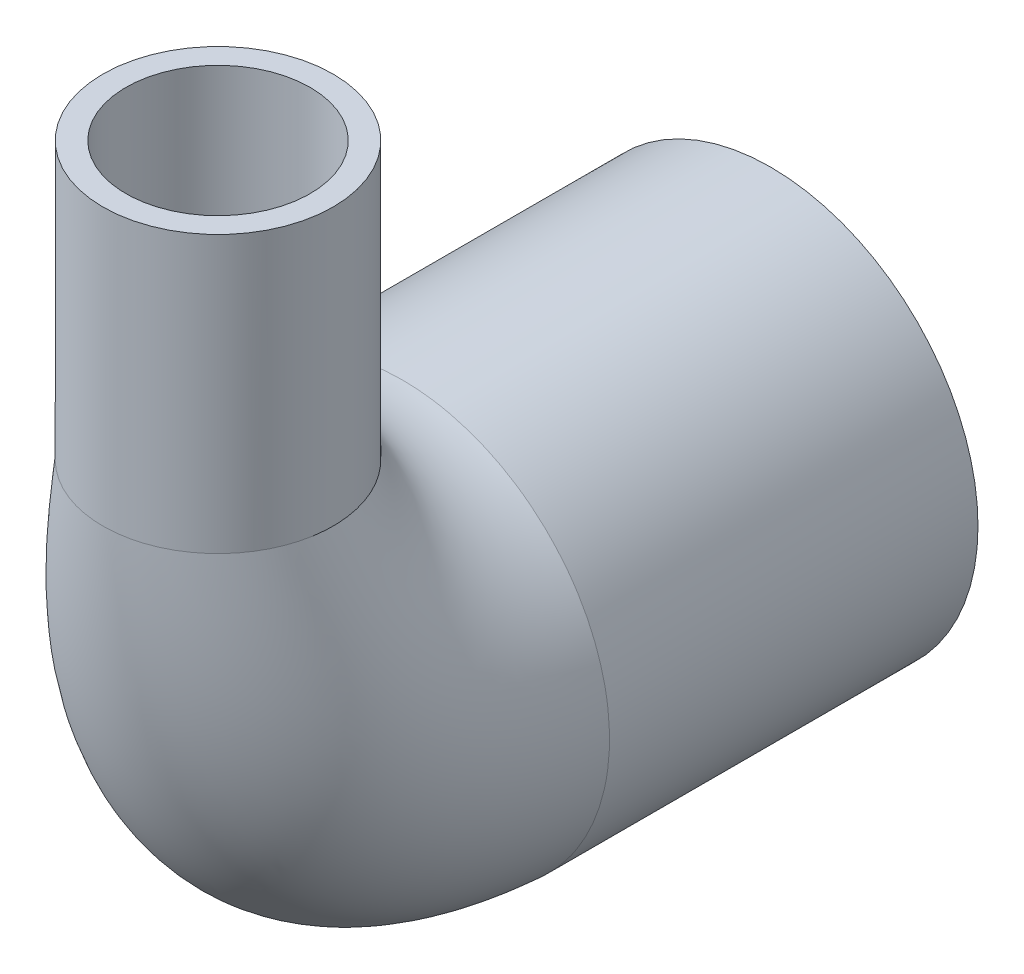
ISO-10303-21;
HEADER;
FILE_DESCRIPTION(('STEP AP214'),'2;1');
FILE_NAME('part.step','',(''),(''),'','','');
FILE_SCHEMA(('AUTOMOTIVE_DESIGN { 1 0 10303 214 1 1 1 1 }'));
ENDSEC;
DATA;
#1=APPLICATION_CONTEXT('core data for automotive mechanical design processes');
#2=APPLICATION_PROTOCOL_DEFINITION('international standard','automotive_design',2000,#1);
#3=PRODUCT_CONTEXT('',#1,'mechanical');
#4=PRODUCT('Part','Part','',(#3));
#5=PRODUCT_RELATED_PRODUCT_CATEGORY('part','',(#4));
#6=PRODUCT_DEFINITION_FORMATION('','',#4);
#7=PRODUCT_DEFINITION_CONTEXT('part definition',#1,'design');
#8=PRODUCT_DEFINITION('design','',#6,#7);
#9=PRODUCT_DEFINITION_SHAPE('','',#8);
#10=(LENGTH_UNIT() NAMED_UNIT(*) SI_UNIT(.MILLI.,.METRE.));
#11=(NAMED_UNIT(*) PLANE_ANGLE_UNIT() SI_UNIT($,.RADIAN.));
#12=(NAMED_UNIT(*) SI_UNIT($,.STERADIAN.) SOLID_ANGLE_UNIT());
#13=UNCERTAINTY_MEASURE_WITH_UNIT(LENGTH_MEASURE(1.E-05),#10,'distance_accuracy_value','');
#14=(GEOMETRIC_REPRESENTATION_CONTEXT(3) GLOBAL_UNCERTAINTY_ASSIGNED_CONTEXT((#13)) GLOBAL_UNIT_ASSIGNED_CONTEXT((#10,
#11,#12)) REPRESENTATION_CONTEXT('',''));
#15=CARTESIAN_POINT('',(0.,0.,0.));
#16=DIRECTION('',(0.,0.,1.));
#17=DIRECTION('',(1.,0.,0.));
#18=AXIS2_PLACEMENT_3D('',#15,#16,#17);
#19=CARTESIAN_POINT('',(0.,34.925,12.7));
#20=DIRECTION('',(0.,-1.,0.));
#21=DIRECTION('',(0.,0.,1.));
#22=AXIS2_PLACEMENT_3D('',#19,#20,#21);
#23=CYLINDRICAL_SURFACE('',#22,7.9375);
#24=CARTESIAN_POINT('',(0.,34.925,12.7));
#25=DIRECTION('',(0.,-1.,0.));
#26=DIRECTION('',(0.,0.,-1.));
#27=AXIS2_PLACEMENT_3D('',#24,#25,#26);
#28=CIRCLE('',#27,7.9375);
#29=CARTESIAN_POINT('',(0.,34.925,4.7625));
#30=VERTEX_POINT('',#29);
#31=EDGE_CURVE('E11',#30,#30,#28,.T.);
#32=ORIENTED_EDGE('',*,*,#31,.T.);
#33=EDGE_LOOP('',(#32));
#34=FACE_BOUND('',#33,.T.);
#35=CARTESIAN_POINT('',(0.,15.875,4.7625));
#36=CARTESIAN_POINT('',(1.03901631203661,15.875,4.7625));
#37=CARTESIAN_POINT('',(3.11660011568606,15.875,5.17531265422968));
#38=CARTESIAN_POINT('',(5.75911265232572,15.875,6.94111772182166));
#39=CARTESIAN_POINT('',(7.52441747909447,15.875,9.58324716542323));
#40=CARTESIAN_POINT('',(8.14446456888548,15.875,12.7));
#41=CARTESIAN_POINT('',(7.52441747909448,15.875,15.8167528345768));
#42=CARTESIAN_POINT('',(5.7591126523257,15.875,18.4588822781783));
#43=CARTESIAN_POINT('',(3.11660011568607,15.875,20.2246873457703));
#44=CARTESIAN_POINT('',(1.03901631203661,15.875,20.6375));
#45=CARTESIAN_POINT('',(-1.03901631203661,15.875,20.6375));
#46=CARTESIAN_POINT('',(-3.11660011568606,15.875,20.2246873457703));
#47=CARTESIAN_POINT('',(-5.75911265232573,15.875,18.4588822781783));
#48=CARTESIAN_POINT('',(-7.52441747909447,15.875,15.8167528345768));
#49=CARTESIAN_POINT('',(-8.14446456888548,15.875,12.7));
#50=CARTESIAN_POINT('',(-7.52441747909448,15.875,9.58324716542323));
#51=CARTESIAN_POINT('',(-5.75911265232571,15.875,6.94111772182166));
#52=CARTESIAN_POINT('',(-3.11660011568607,15.875,5.17531265422968));
#53=CARTESIAN_POINT('',(-1.03901631203661,15.875,4.7625));
#54=CARTESIAN_POINT('',(0.,15.875,4.7625));
#55=B_SPLINE_CURVE_WITH_KNOTS('',3,(#35,#36,#37,#38,#39,#40,#41,#42,#43,#44,#45,#46,#47,#48,#49,
#50,#51,#52,#53,#54),.UNSPECIFIED.,.T.,.F.,(4,1,1,1,1,1,1,1,2,1,1,1,1,1,1,1,4),(0.,0.0625,0.125,
0.1875,0.25,0.3125,0.375,0.4375,0.5,0.5625,0.625,0.6875,0.75,0.8125,0.875,0.9375,1.),.UNSPECIFIED.);
#56=CARTESIAN_POINT('',(0.,15.875,4.7625));
#57=VERTEX_POINT('',#56);
#58=EDGE_CURVE('E60',#57,#57,#55,.T.);
#59=ORIENTED_EDGE('',*,*,#58,.F.);
#60=EDGE_LOOP('',(#59));
#61=FACE_BOUND('',#60,.T.);
#62=ADVANCED_FACE('F45',(#34,#61),#23,.T.);
#63=CARTESIAN_POINT('',(0.,34.925,12.7));
#64=DIRECTION('',(0.,1.,0.));
#65=DIRECTION('',(0.,0.,-1.));
#66=AXIS2_PLACEMENT_3D('',#63,#64,#65);
#67=PLANE('',#66);
#68=CARTESIAN_POINT('',(0.,34.925,12.7));
#69=DIRECTION('',(0.,-1.,0.));
#70=DIRECTION('',(0.,0.,-1.));
#71=AXIS2_PLACEMENT_3D('',#68,#69,#70);
#72=CIRCLE('',#71,6.35);
#73=CARTESIAN_POINT('',(0.,34.925,6.35));
#74=VERTEX_POINT('',#73);
#75=EDGE_CURVE('E55',#74,#74,#72,.T.);
#76=ORIENTED_EDGE('',*,*,#75,.T.);
#77=EDGE_LOOP('',(#76));
#78=FACE_BOUND('',#77,.T.);
#79=ORIENTED_EDGE('',*,*,#31,.F.);
#80=EDGE_LOOP('',(#79));
#81=FACE_BOUND('',#80,.T.);
#82=ADVANCED_FACE('F95',(#78,#81),#67,.T.);
#83=CARTESIAN_POINT('',(0.,15.875,12.7));
#84=DIRECTION('',(0.,1.,0.));
#85=DIRECTION('',(0.,0.,-1.));
#86=AXIS2_PLACEMENT_3D('',#83,#84,#85);
#87=CYLINDRICAL_SURFACE('',#86,6.35);
#88=CARTESIAN_POINT('',(0.,15.875,6.35));
#89=CARTESIAN_POINT('',(-0.831213049629288,15.875,6.35));
#90=CARTESIAN_POINT('',(-2.49329864021113,15.875,6.68022769998427));
#91=CARTESIAN_POINT('',(-4.60717931448023,15.875,8.09289219249636));
#92=CARTESIAN_POINT('',(-6.01961280137387,15.875,10.2065828619552));
#93=CARTESIAN_POINT('',(-6.5155211618228,15.875,12.7));
#94=CARTESIAN_POINT('',(-6.01961280137387,15.875,15.1934171380447));
#95=CARTESIAN_POINT('',(-4.60717931448022,15.875,17.3071078075037));
#96=CARTESIAN_POINT('',(-2.49329864021115,15.875,18.7197723000157));
#97=CARTESIAN_POINT('',(-0.831213049629288,15.875,19.05));
#98=CARTESIAN_POINT('',(0.831213049629286,15.875,19.05));
#99=CARTESIAN_POINT('',(2.49329864021113,15.875,18.7197723000157));
#100=CARTESIAN_POINT('',(4.60717931448023,15.875,17.3071078075036));
#101=CARTESIAN_POINT('',(6.01961280137386,15.875,15.1934171380447));
#102=CARTESIAN_POINT('',(6.5155211618228,15.875,12.7));
#103=CARTESIAN_POINT('',(6.01961280137387,15.875,10.2065828619553));
#104=CARTESIAN_POINT('',(4.60717931448022,15.875,8.09289219249633));
#105=CARTESIAN_POINT('',(2.49329864021114,15.875,6.68022769998429));
#106=CARTESIAN_POINT('',(0.831213049629285,15.875,6.35));
#107=CARTESIAN_POINT('',(0.,15.875,6.35));
#108=B_SPLINE_CURVE_WITH_KNOTS('',3,(#88,#89,#90,#91,#92,#93,#94,#95,#96,#97,#98,#99,#100,#101,
#102,#103,#104,#105,#106,#107),.UNSPECIFIED.,.T.,.F.,(4,1,1,1,1,1,1,1,2,1,1,1,1,1,1,1,4),(0.,
0.0625,0.125,0.1875,0.25,0.3125,0.375,0.4375,0.5,0.5625,0.625,0.6875,0.75,0.8125,0.875,0.9375,
1.),.UNSPECIFIED.);
#109=CARTESIAN_POINT('',(0.,15.875,6.35));
#110=VERTEX_POINT('',#109);
#111=EDGE_CURVE('E80',#110,#110,#108,.F.);
#112=ORIENTED_EDGE('',*,*,#111,.T.);
#113=EDGE_LOOP('',(#112));
#114=FACE_BOUND('',#113,.T.);
#115=ORIENTED_EDGE('',*,*,#75,.F.);
#116=EDGE_LOOP('',(#115));
#117=FACE_BOUND('',#116,.T.);
#118=ADVANCED_FACE('F85',(#114,#117),#87,.F.);
#119=CARTESIAN_POINT('',(0.,14.2875,0.));
#120=CARTESIAN_POINT('',(0.,14.2875,3.175));
#121=CARTESIAN_POINT('',(0.,15.113,4.7625));
#122=CARTESIAN_POINT('',(0.,15.875,4.7625));
#123=CARTESIAN_POINT('',(1.8702293616659,14.2875,0.));
#124=CARTESIAN_POINT('',(1.5931583451228,14.2875,3.175));
#125=CARTESIAN_POINT('',(1.3160873285797,15.113,4.7625));
#126=CARTESIAN_POINT('',(1.03901631203661,15.875,4.7625));
#127=CARTESIAN_POINT('',(5.61001135472224,13.5442463688287,0.));
#128=CARTESIAN_POINT('',(4.77887427504352,13.4943413292191,3.64333338474323));
#129=CARTESIAN_POINT('',(3.94773719536479,14.7898425396096,5.20307301948645));
#130=CARTESIAN_POINT('',(3.11660011568606,15.875,5.17531265422968));
#131=CARTESIAN_POINT('',(10.3662299142062,10.3660680461271,0.));
#132=CARTESIAN_POINT('',(8.83052416024602,10.2593448432514,5.47216944894056));
#133=CARTESIAN_POINT('',(7.29481840628587,13.4476763278757,7.00039358538111));
#134=CARTESIAN_POINT('',(5.75911265232572,15.875,6.94111772182166));
#135=CARTESIAN_POINT('',(13.5439910202834,5.61016906306011,0.));
#136=CARTESIAN_POINT('',(11.5374665065538,5.52605020870675,8.08920738847441));
#137=CARTESIAN_POINT('',(9.53094199282413,11.4664938543534,9.62997727694882));
#138=CARTESIAN_POINT('',(7.52441747909447,15.875,9.58324716542323));
#139=CARTESIAN_POINT('',(14.6600049875499,0.,0.));
#140=CARTESIAN_POINT('',(12.4881581813284,0.,11.1125));
#141=CARTESIAN_POINT('',(10.316311375107,9.14400000000001,12.7));
#142=CARTESIAN_POINT('',(8.14446456888548,15.875,12.7));
#143=CARTESIAN_POINT('',(13.5439910202834,-5.61016906306017,0.));
#144=CARTESIAN_POINT('',(11.5374665065538,-5.52605020870677,14.1357926115256));
#145=CARTESIAN_POINT('',(9.53094199282413,6.82150614564664,15.7700227230512));
#146=CARTESIAN_POINT('',(7.52441747909448,15.875,15.8167528345768));
#147=CARTESIAN_POINT('',(10.3662299142062,-10.366068046127,0.));
#148=CARTESIAN_POINT('',(8.83052416024602,-10.2593448432513,16.7528305510594));
#149=CARTESIAN_POINT('',(7.29481840628586,4.84032367212433,18.3996064146189));
#150=CARTESIAN_POINT('',(5.7591126523257,15.875,18.4588822781783));
#151=CARTESIAN_POINT('',(5.61001135472226,-13.5442463688287,0.));
#152=CARTESIAN_POINT('',(4.77887427504353,-13.4943413292191,18.5816666152568));
#153=CARTESIAN_POINT('',(3.9477371953648,3.49815746039044,20.1969269805136));
#154=CARTESIAN_POINT('',(3.11660011568607,15.875,20.2246873457703));
#155=CARTESIAN_POINT('',(1.87022936166589,-14.2875,0.));
#156=CARTESIAN_POINT('',(1.5931583451228,-14.2875,19.05));
#157=CARTESIAN_POINT('',(1.3160873285797,3.17500000000001,20.6375));
#158=CARTESIAN_POINT('',(1.03901631203661,15.875,20.6375));
#159=CARTESIAN_POINT('',(-1.8702293616659,-14.2875,0.));
#160=CARTESIAN_POINT('',(-1.5931583451228,-14.2875,19.05));
#161=CARTESIAN_POINT('',(-1.3160873285797,3.17500000000001,20.6375));
#162=CARTESIAN_POINT('',(-1.03901631203661,15.875,20.6375));
#163=CARTESIAN_POINT('',(-5.61001135472223,-13.5442463688287,0.));
#164=CARTESIAN_POINT('',(-4.77887427504351,-13.4943413292191,18.5816666152568));
#165=CARTESIAN_POINT('',(-3.94773719536479,3.49815746039046,20.1969269805136));
#166=CARTESIAN_POINT('',(-3.11660011568606,15.875,20.2246873457703));
#167=CARTESIAN_POINT('',(-10.3662299142062,-10.3660680461271,0.));
#168=CARTESIAN_POINT('',(-8.83052416024603,-10.2593448432514,16.7528305510594));
#169=CARTESIAN_POINT('',(-7.29481840628588,4.84032367212432,18.3996064146189));
#170=CARTESIAN_POINT('',(-5.75911265232573,15.875,18.4588822781783));
#171=CARTESIAN_POINT('',(-13.5439910202834,-5.61016906306011,0.));
#172=CARTESIAN_POINT('',(-11.5374665065538,-5.52605020870674,14.1357926115256));
#173=CARTESIAN_POINT('',(-9.53094199282412,6.82150614564665,15.7700227230512));
#174=CARTESIAN_POINT('',(-7.52441747909447,15.875,15.8167528345768));
#175=CARTESIAN_POINT('',(-14.6600049875499,0.,0.));
#176=CARTESIAN_POINT('',(-12.4881581813284,0.,11.1125));
#177=CARTESIAN_POINT('',(-10.3163113751069,9.14399999999999,12.7));
#178=CARTESIAN_POINT('',(-8.14446456888548,15.875,12.7));
#179=CARTESIAN_POINT('',(-13.5439910202834,5.61016906306014,0.));
#180=CARTESIAN_POINT('',(-11.5374665065538,5.52605020870677,8.08920738847441));
#181=CARTESIAN_POINT('',(-9.53094199282414,11.4664938543534,9.62997727694882));
#182=CARTESIAN_POINT('',(-7.52441747909448,15.875,9.58324716542323));
#183=CARTESIAN_POINT('',(-10.3662299142061,10.366068046127,0.));
#184=CARTESIAN_POINT('',(-8.830524160246,10.2593448432514,5.47216944894056));
#185=CARTESIAN_POINT('',(-7.29481840628586,13.4476763278757,7.00039358538111));
#186=CARTESIAN_POINT('',(-5.75911265232571,15.875,6.94111772182166));
#187=CARTESIAN_POINT('',(-5.61001135472226,13.5442463688287,0.));
#188=CARTESIAN_POINT('',(-4.77887427504353,13.4943413292191,3.64333338474323));
#189=CARTESIAN_POINT('',(-3.9477371953648,14.7898425396096,5.20307301948645));
#190=CARTESIAN_POINT('',(-3.11660011568607,15.875,5.17531265422968));
#191=CARTESIAN_POINT('',(-1.87022936166589,14.2875,0.));
#192=CARTESIAN_POINT('',(-1.5931583451228,14.2875,3.175));
#193=CARTESIAN_POINT('',(-1.3160873285797,15.113,4.7625));
#194=CARTESIAN_POINT('',(-1.03901631203661,15.875,4.7625));
#195=CARTESIAN_POINT('',(0.,14.2875,0.));
#196=CARTESIAN_POINT('',(0.,14.2875,3.175));
#197=CARTESIAN_POINT('',(0.,15.113,4.7625));
#198=CARTESIAN_POINT('',(0.,15.875,4.7625));
#199=B_SPLINE_SURFACE_WITH_KNOTS('',3,3,((#119,#120,#121,#122),(#123,#124,#125,#126),(#127,#128,
#129,#130),(#131,#132,#133,#134),(#135,#136,#137,#138),(#139,#140,#141,#142),(#143,#144,#145,
#146),(#147,#148,#149,#150),(#151,#152,#153,#154),(#155,#156,#157,#158),(#159,#160,#161,#162),
(#163,#164,#165,#166),(#167,#168,#169,#170),(#171,#172,#173,#174),(#175,#176,#177,#178),(#179,
#180,#181,#182),(#183,#184,#185,#186),(#187,#188,#189,#190),(#191,#192,#193,#194),(#195,#196,
#197,#198)),.UNSPECIFIED.,.T.,.F.,.F.,(4,1,1,1,1,1,1,1,2,1,1,1,1,1,1,1,4),(4,4),(0.,0.0625,
0.125,0.1875,0.25,0.3125,0.375,0.4375,0.5,0.5625,0.625,0.6875,0.75,0.8125,0.875,0.9375,1.),(0.,
1.),.UNSPECIFIED.);
#200=CARTESIAN_POINT('',(0.,14.2875,0.));
#201=CARTESIAN_POINT('',(-1.87022936166589,14.2875,0.));
#202=CARTESIAN_POINT('',(-5.61001135472226,13.5442463688287,0.));
#203=CARTESIAN_POINT('',(-10.3662299142061,10.366068046127,0.));
#204=CARTESIAN_POINT('',(-13.5439910202834,5.61016906306014,0.));
#205=CARTESIAN_POINT('',(-14.6600049875499,0.,0.));
#206=CARTESIAN_POINT('',(-13.5439910202834,-5.61016906306011,0.));
#207=CARTESIAN_POINT('',(-10.3662299142062,-10.3660680461271,0.));
#208=CARTESIAN_POINT('',(-5.61001135472223,-13.5442463688287,0.));
#209=CARTESIAN_POINT('',(-1.8702293616659,-14.2875,0.));
#210=CARTESIAN_POINT('',(1.87022936166589,-14.2875,0.));
#211=CARTESIAN_POINT('',(5.61001135472226,-13.5442463688287,0.));
#212=CARTESIAN_POINT('',(10.3662299142062,-10.366068046127,0.));
#213=CARTESIAN_POINT('',(13.5439910202834,-5.61016906306017,0.));
#214=CARTESIAN_POINT('',(14.6600049875499,0.,0.));
#215=CARTESIAN_POINT('',(13.5439910202834,5.61016906306011,0.));
#216=CARTESIAN_POINT('',(10.3662299142062,10.3660680461271,0.));
#217=CARTESIAN_POINT('',(5.61001135472224,13.5442463688287,0.));
#218=CARTESIAN_POINT('',(1.8702293616659,14.2875,0.));
#219=CARTESIAN_POINT('',(0.,14.2875,0.));
#220=B_SPLINE_CURVE_WITH_KNOTS('',3,(#200,#201,#202,#203,#204,#205,#206,#207,#208,#209,#210,
#211,#212,#213,#214,#215,#216,#217,#218,#219),.UNSPECIFIED.,.T.,.F.,(4,1,1,1,1,1,1,1,2,1,1,1,1,
1,1,1,4),(0.,0.0625,0.125,0.1875,0.25,0.3125,0.375,0.4375,0.5,0.5625,0.625,0.6875,0.75,0.8125,
0.875,0.9375,1.),.UNSPECIFIED.);
#221=CARTESIAN_POINT('',(0.,14.2875,0.));
#222=VERTEX_POINT('',#221);
#223=EDGE_CURVE('E203',#222,#222,#220,.T.);
#224=ORIENTED_EDGE('',*,*,#223,.T.);
#225=EDGE_LOOP('',(#224));
#226=FACE_BOUND('',#225,.T.);
#227=ORIENTED_EDGE('',*,*,#58,.T.);
#228=EDGE_LOOP('',(#227));
#229=FACE_BOUND('',#228,.T.);
#230=ADVANCED_FACE('F94',(#226,#229),#199,.F.);
#231=CARTESIAN_POINT('',(0.,0.,-25.4));
#232=DIRECTION('',(0.,0.,1.));
#233=DIRECTION('',(-1.,0.,0.));
#234=AXIS2_PLACEMENT_3D('',#231,#232,#233);
#235=CYLINDRICAL_SURFACE('',#234,14.2875);
#236=CARTESIAN_POINT('',(0.,0.,-25.4));
#237=DIRECTION('',(0.,0.,1.));
#238=DIRECTION('',(1.,0.,0.));
#239=AXIS2_PLACEMENT_3D('',#236,#237,#238);
#240=CIRCLE('',#239,14.2875);
#241=CARTESIAN_POINT('',(14.2875,0.,-25.4));
#242=VERTEX_POINT('',#241);
#243=EDGE_CURVE('E199',#242,#242,#240,.T.);
#244=ORIENTED_EDGE('',*,*,#243,.T.);
#245=EDGE_LOOP('',(#244));
#246=FACE_BOUND('',#245,.T.);
#247=ORIENTED_EDGE('',*,*,#223,.F.);
#248=EDGE_LOOP('',(#247));
#249=FACE_BOUND('',#248,.T.);
#250=ADVANCED_FACE('F129',(#246,#249),#235,.T.);
#251=CARTESIAN_POINT('',(0.,0.,-25.4));
#252=DIRECTION('',(0.,0.,-1.));
#253=DIRECTION('',(1.,0.,0.));
#254=AXIS2_PLACEMENT_3D('',#251,#252,#253);
#255=PLANE('',#254);
#256=CARTESIAN_POINT('',(0.,0.,-25.4));
#257=DIRECTION('',(0.,0.,1.));
#258=DIRECTION('',(1.,0.,0.));
#259=AXIS2_PLACEMENT_3D('',#256,#257,#258);
#260=CIRCLE('',#259,12.7);
#261=CARTESIAN_POINT('',(12.7,0.,-25.4));
#262=VERTEX_POINT('',#261);
#263=EDGE_CURVE('E191',#262,#262,#260,.T.);
#264=ORIENTED_EDGE('',*,*,#263,.T.);
#265=EDGE_LOOP('',(#264));
#266=FACE_BOUND('',#265,.T.);
#267=ORIENTED_EDGE('',*,*,#243,.F.);
#268=EDGE_LOOP('',(#267));
#269=FACE_BOUND('',#268,.T.);
#270=ADVANCED_FACE('F138',(#266,#269),#255,.T.);
#271=CARTESIAN_POINT('',(0.,0.,20.6375));
#272=DIRECTION('',(0.,0.,-1.));
#273=DIRECTION('',(1.,0.,0.));
#274=AXIS2_PLACEMENT_3D('',#271,#272,#273);
#275=CYLINDRICAL_SURFACE('',#274,12.7);
#276=ORIENTED_EDGE('',*,*,#263,.F.);
#277=EDGE_LOOP('',(#276));
#278=FACE_BOUND('',#277,.T.);
#279=CARTESIAN_POINT('',(0.,12.7,0.));
#280=CARTESIAN_POINT('',(1.66242609925857,12.7,0.));
#281=CARTESIAN_POINT('',(4.98674352459386,12.0394316252888,0.));
#282=CARTESIAN_POINT('',(9.21440307575486,9.21422769477124,0.));
#283=CARTESIAN_POINT('',(12.0391222501806,4.98683363342622,0.));
#284=CARTESIAN_POINT('',(13.0310999253835,0.,0.));
#285=CARTESIAN_POINT('',(12.0391222501806,-4.98683363342623,0.));
#286=CARTESIAN_POINT('',(9.21440307575486,-9.21422769477131,0.));
#287=CARTESIAN_POINT('',(4.98674352459382,-12.0394316252888,0.));
#288=CARTESIAN_POINT('',(1.66242609925857,-12.7,0.));
#289=CARTESIAN_POINT('',(-1.66242609925857,-12.7,0.));
#290=CARTESIAN_POINT('',(-4.98674352459381,-12.0394316252888,0.));
#291=CARTESIAN_POINT('',(-9.21440307575491,-9.21422769477126,0.));
#292=CARTESIAN_POINT('',(-12.0391222501805,-4.98683363342621,0.));
#293=CARTESIAN_POINT('',(-13.0310999253835,0.,0.));
#294=CARTESIAN_POINT('',(-12.0391222501805,4.98683363342624,0.));
#295=CARTESIAN_POINT('',(-9.21440307575489,9.2142276947713,0.));
#296=CARTESIAN_POINT('',(-4.9867435245938,12.0394316252888,0.));
#297=CARTESIAN_POINT('',(-1.66242609925857,12.7,0.));
#298=CARTESIAN_POINT('',(0.,12.7,0.));
#299=B_SPLINE_CURVE_WITH_KNOTS('',3,(#279,#280,#281,#282,#283,#284,#285,#286,#287,#288,#289,
#290,#291,#292,#293,#294,#295,#296,#297,#298),.UNSPECIFIED.,.T.,.F.,(4,1,1,1,1,1,1,1,2,1,1,1,1,
1,1,1,4),(0.,0.0625,0.125,0.1875,0.25,0.3125,0.375,0.4375,0.5,0.5625,0.625,0.6875,0.75,0.8125,
0.875,0.9375,1.),.UNSPECIFIED.);
#300=CARTESIAN_POINT('',(0.,12.7,0.));
#301=VERTEX_POINT('',#300);
#302=EDGE_CURVE('E200',#301,#301,#299,.F.);
#303=ORIENTED_EDGE('',*,*,#302,.T.);
#304=EDGE_LOOP('',(#303));
#305=FACE_BOUND('',#304,.T.);
#306=ADVANCED_FACE('F147',(#278,#305),#275,.F.);
#307=CARTESIAN_POINT('',(0.,15.875,6.35));
#308=CARTESIAN_POINT('',(0.,13.843,6.35));
#309=CARTESIAN_POINT('',(0.,12.7,3.175));
#310=CARTESIAN_POINT('',(0.,12.7,0.));
#311=CARTESIAN_POINT('',(-0.831213049629288,15.875,6.35));
#312=CARTESIAN_POINT('',(-1.10828406617238,13.843,6.35));
#313=CARTESIAN_POINT('',(-1.38535508271548,12.7,3.175));
#314=CARTESIAN_POINT('',(-1.66242609925857,12.7,0.));
#315=CARTESIAN_POINT('',(-2.49329864021113,15.875,6.68022769998427));
#316=CARTESIAN_POINT('',(-3.32444693500535,13.3555813750963,6.70244346665618));
#317=CARTESIAN_POINT('',(-4.15559522979957,11.9950377501926,3.45044048332809));
#318=CARTESIAN_POINT('',(-4.9867435245938,12.0394316252888,0.));
#319=CARTESIAN_POINT('',(-4.60717931448023,15.875,8.09289219249636));
#320=CARTESIAN_POINT('',(-6.14292056823845,11.4117373565904,8.14031354499758));
#321=CARTESIAN_POINT('',(-7.67866182199667,9.11938096318087,4.54144583499879));
#322=CARTESIAN_POINT('',(-9.21440307575489,9.2142276947713,0.));
#323=CARTESIAN_POINT('',(-6.01961280137387,15.875,10.2065828619552));
#324=CARTESIAN_POINT('',(-8.02611595097608,8.59965287780875,10.2439719079702));
#325=CARTESIAN_POINT('',(-10.0326191005783,4.91205575561749,6.11417345398508));
#326=CARTESIAN_POINT('',(-12.0391222501805,4.98683363342624,0.));
#327=CARTESIAN_POINT('',(-6.5155211618228,15.875,12.7));
#328=CARTESIAN_POINT('',(-8.68738074967638,5.33399999999999,12.7));
#329=CARTESIAN_POINT('',(-10.85924033753,0.,7.93750000000001));
#330=CARTESIAN_POINT('',(-13.0310999253835,0.,0.));
#331=CARTESIAN_POINT('',(-6.01961280137387,15.875,15.1934171380447));
#332=CARTESIAN_POINT('',(-8.02611595097609,2.06834712219128,15.1560280920298));
#333=CARTESIAN_POINT('',(-10.0326191005783,-4.91205575561747,9.7608265460149));
#334=CARTESIAN_POINT('',(-12.0391222501805,-4.98683363342621,0.));
#335=CARTESIAN_POINT('',(-4.60717931448022,15.875,17.3071078075037));
#336=CARTESIAN_POINT('',(-6.14292056823845,-0.743737356590435,17.2596864550025));
#337=CARTESIAN_POINT('',(-7.67866182199668,-9.11938096318085,11.3335541650012));
#338=CARTESIAN_POINT('',(-9.21440307575491,-9.21422769477126,0.));
#339=CARTESIAN_POINT('',(-2.49329864021115,15.875,18.7197723000157));
#340=CARTESIAN_POINT('',(-3.32444693500537,-2.68758137509627,18.6975565333438));
#341=CARTESIAN_POINT('',(-4.15559522979959,-11.9950377501925,12.4245595166719));
#342=CARTESIAN_POINT('',(-4.98674352459381,-12.0394316252888,0.));
#343=CARTESIAN_POINT('',(-0.831213049629288,15.875,19.05));
#344=CARTESIAN_POINT('',(-1.10828406617238,-3.175,19.05));
#345=CARTESIAN_POINT('',(-1.38535508271548,-12.7,12.7));
#346=CARTESIAN_POINT('',(-1.66242609925857,-12.7,0.));
#347=CARTESIAN_POINT('',(0.831213049629286,15.875,19.05));
#348=CARTESIAN_POINT('',(1.10828406617238,-3.175,19.05));
#349=CARTESIAN_POINT('',(1.38535508271548,-12.7,12.7));
#350=CARTESIAN_POINT('',(1.66242609925857,-12.7,0.));
#351=CARTESIAN_POINT('',(2.49329864021113,15.875,18.7197723000157));
#352=CARTESIAN_POINT('',(3.32444693500536,-2.68758137509627,18.6975565333438));
#353=CARTESIAN_POINT('',(4.15559522979959,-11.9950377501925,12.4245595166719));
#354=CARTESIAN_POINT('',(4.98674352459382,-12.0394316252888,0.));
#355=CARTESIAN_POINT('',(4.60717931448023,15.875,17.3071078075036));
#356=CARTESIAN_POINT('',(6.14292056823844,-0.743737356590456,17.2596864550024));
#357=CARTESIAN_POINT('',(7.67866182199665,-9.11938096318088,11.3335541650012));
#358=CARTESIAN_POINT('',(9.21440307575486,-9.21422769477131,0.));
#359=CARTESIAN_POINT('',(6.01961280137386,15.875,15.1934171380447));
#360=CARTESIAN_POINT('',(8.02611595097609,2.06834712219128,15.1560280920298));
#361=CARTESIAN_POINT('',(10.0326191005783,-4.91205575561747,9.76082654601491));
#362=CARTESIAN_POINT('',(12.0391222501806,-4.98683363342623,0.));
#363=CARTESIAN_POINT('',(6.5155211618228,15.875,12.7));
#364=CARTESIAN_POINT('',(8.68738074967636,5.33399999999998,12.7));
#365=CARTESIAN_POINT('',(10.8592403375299,0.,7.9375));
#366=CARTESIAN_POINT('',(13.0310999253835,0.,0.));
#367=CARTESIAN_POINT('',(6.01961280137387,15.875,10.2065828619553));
#368=CARTESIAN_POINT('',(8.02611595097611,8.59965287780875,10.2439719079702));
#369=CARTESIAN_POINT('',(10.0326191005784,4.91205575561749,6.1141734539851));
#370=CARTESIAN_POINT('',(12.0391222501806,4.98683363342622,0.));
#371=CARTESIAN_POINT('',(4.60717931448022,15.875,8.09289219249633));
#372=CARTESIAN_POINT('',(6.14292056823844,11.4117373565904,8.14031354499756));
#373=CARTESIAN_POINT('',(7.67866182199665,9.11938096318082,4.54144583499878));
#374=CARTESIAN_POINT('',(9.21440307575486,9.21422769477124,0.));
#375=CARTESIAN_POINT('',(2.49329864021114,15.875,6.68022769998429));
#376=CARTESIAN_POINT('',(3.32444693500538,13.3555813750963,6.70244346665619));
#377=CARTESIAN_POINT('',(4.15559522979962,11.9950377501926,3.4504404833281));
#378=CARTESIAN_POINT('',(4.98674352459386,12.0394316252888,0.));
#379=CARTESIAN_POINT('',(0.831213049629285,15.875,6.35));
#380=CARTESIAN_POINT('',(1.10828406617238,13.843,6.35));
#381=CARTESIAN_POINT('',(1.38535508271548,12.7,3.175));
#382=CARTESIAN_POINT('',(1.66242609925857,12.7,0.));
#383=CARTESIAN_POINT('',(0.,15.875,6.35));
#384=CARTESIAN_POINT('',(0.,13.843,6.35));
#385=CARTESIAN_POINT('',(0.,12.7,3.175));
#386=CARTESIAN_POINT('',(0.,12.7,0.));
#387=B_SPLINE_SURFACE_WITH_KNOTS('',3,3,((#307,#308,#309,#310),(#311,#312,#313,#314),(#315,#316,
#317,#318),(#319,#320,#321,#322),(#323,#324,#325,#326),(#327,#328,#329,#330),(#331,#332,#333,
#334),(#335,#336,#337,#338),(#339,#340,#341,#342),(#343,#344,#345,#346),(#347,#348,#349,#350),
(#351,#352,#353,#354),(#355,#356,#357,#358),(#359,#360,#361,#362),(#363,#364,#365,#366),(#367,
#368,#369,#370),(#371,#372,#373,#374),(#375,#376,#377,#378),(#379,#380,#381,#382),(#383,#384,
#385,#386)),.UNSPECIFIED.,.T.,.F.,.F.,(4,1,1,1,1,1,1,1,2,1,1,1,1,1,1,1,4),(4,4),(0.,0.0625,
0.125,0.1875,0.25,0.3125,0.375,0.4375,0.5,0.5625,0.625,0.6875,0.75,0.8125,0.875,0.9375,1.),(0.,
1.),.UNSPECIFIED.);
#388=ORIENTED_EDGE('',*,*,#111,.F.);
#389=EDGE_LOOP('',(#388));
#390=FACE_BOUND('',#389,.T.);
#391=ORIENTED_EDGE('',*,*,#302,.F.);
#392=EDGE_LOOP('',(#391));
#393=FACE_BOUND('',#392,.T.);
#394=ADVANCED_FACE('F157',(#390,#393),#387,.T.);
#395=CLOSED_SHELL('',(#62,#82,#118,#230,#250,#270,#306,#394));
#396=MANIFOLD_SOLID_BREP('B2',#395);
#397=ADVANCED_BREP_SHAPE_REPRESENTATION('',(#18,#396),#14);
#398=SHAPE_DEFINITION_REPRESENTATION(#9,#397);
ENDSEC;
END-ISO-10303-21;
